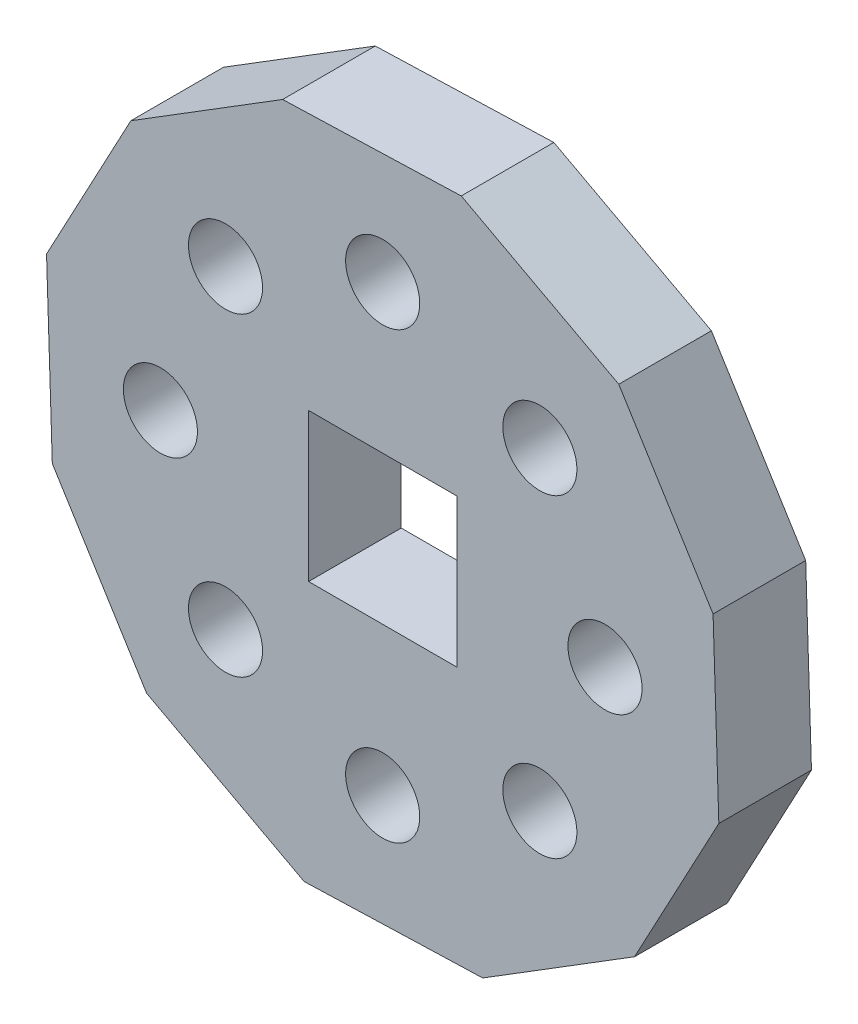
ISO-10303-21;
HEADER;
FILE_DESCRIPTION(('STEP AP214'),'2;1');
FILE_NAME('part.step','',(''),(''),'','','');
FILE_SCHEMA(('AUTOMOTIVE_DESIGN { 1 0 10303 214 1 1 1 1 }'));
ENDSEC;
DATA;
#1=APPLICATION_CONTEXT('core data for automotive mechanical design processes');
#2=APPLICATION_PROTOCOL_DEFINITION('international standard','automotive_design',2000,#1);
#3=PRODUCT_CONTEXT('',#1,'mechanical');
#4=PRODUCT('Part','Part','',(#3));
#5=PRODUCT_RELATED_PRODUCT_CATEGORY('part','',(#4));
#6=PRODUCT_DEFINITION_FORMATION('','',#4);
#7=PRODUCT_DEFINITION_CONTEXT('part definition',#1,'design');
#8=PRODUCT_DEFINITION('design','',#6,#7);
#9=PRODUCT_DEFINITION_SHAPE('','',#8);
#10=(LENGTH_UNIT() NAMED_UNIT(*) SI_UNIT(.MILLI.,.METRE.));
#11=(NAMED_UNIT(*) PLANE_ANGLE_UNIT() SI_UNIT($,.RADIAN.));
#12=(NAMED_UNIT(*) SI_UNIT($,.STERADIAN.) SOLID_ANGLE_UNIT());
#13=UNCERTAINTY_MEASURE_WITH_UNIT(LENGTH_MEASURE(1.E-05),#10,'distance_accuracy_value','');
#14=(GEOMETRIC_REPRESENTATION_CONTEXT(3) GLOBAL_UNCERTAINTY_ASSIGNED_CONTEXT((#13)) GLOBAL_UNIT_ASSIGNED_CONTEXT((#10,
#11,#12)) REPRESENTATION_CONTEXT('',''));
#15=CARTESIAN_POINT('',(0.,0.,0.));
#16=DIRECTION('',(0.,0.,1.));
#17=DIRECTION('',(1.,0.,0.));
#18=AXIS2_PLACEMENT_3D('',#15,#16,#17);
#19=CARTESIAN_POINT('',(0.,0.,25.));
#20=DIRECTION('',(0.,0.,1.));
#21=DIRECTION('',(1.,0.,0.));
#22=AXIS2_PLACEMENT_3D('',#19,#20,#21);
#23=PLANE('',#22);
#24=CARTESIAN_POINT('',(-59.9999999999974,-2.55795384873636E-12,25.));
#25=DIRECTION('',(0.,0.,1.));
#26=DIRECTION('',(1.,0.,0.));
#27=AXIS2_PLACEMENT_3D('',#24,#25,#26);
#28=CIRCLE('',#27,10.0000000000038);
#29=CARTESIAN_POINT('',(-49.9999999999937,-2.55795384873636E-12,25.));
#30=VERTEX_POINT('',#29);
#31=EDGE_CURVE('E565',#30,#30,#28,.T.);
#32=ORIENTED_EDGE('',*,*,#31,.F.);
#33=EDGE_LOOP('',(#32));
#34=FACE_BOUND('',#33,.T.);
#35=CARTESIAN_POINT('',(5.10121193588295E-12,-60.,25.));
#36=DIRECTION('',(0.,0.,1.));
#37=DIRECTION('',(1.,0.,0.));
#38=AXIS2_PLACEMENT_3D('',#35,#36,#37);
#39=CIRCLE('',#38,10.0000000000053);
#40=CARTESIAN_POINT('',(10.0000000000104,-60.,25.));
#41=VERTEX_POINT('',#40);
#42=EDGE_CURVE('E577',#41,#41,#39,.T.);
#43=ORIENTED_EDGE('',*,*,#42,.F.);
#44=EDGE_LOOP('',(#43));
#45=FACE_BOUND('',#44,.T.);
#46=CARTESIAN_POINT('',(60.0000000000025,2.55060596794148E-12,25.));
#47=DIRECTION('',(0.,0.,1.));
#48=DIRECTION('',(1.,0.,0.));
#49=AXIS2_PLACEMENT_3D('',#46,#47,#48);
#50=CIRCLE('',#49,10.0000000000019);
#51=CARTESIAN_POINT('',(70.0000000000044,2.55060596794148E-12,25.));
#52=VERTEX_POINT('',#51);
#53=EDGE_CURVE('E589',#52,#52,#50,.T.);
#54=ORIENTED_EDGE('',*,*,#53,.F.);
#55=EDGE_LOOP('',(#54));
#56=FACE_BOUND('',#55,.T.);
#57=CARTESIAN_POINT('',(0.,60.,25.));
#58=DIRECTION('',(0.,0.,1.));
#59=DIRECTION('',(1.,0.,0.));
#60=AXIS2_PLACEMENT_3D('',#57,#58,#59);
#61=CIRCLE('',#60,10.);
#62=CARTESIAN_POINT('',(10.,60.,25.));
#63=VERTEX_POINT('',#62);
#64=EDGE_CURVE('E175',#63,#63,#61,.T.);
#65=ORIENTED_EDGE('',*,*,#64,.F.);
#66=EDGE_LOOP('',(#65));
#67=FACE_BOUND('',#66,.T.);
#68=DIRECTION('',(-0.881703909292115,0.471803154227482,0.));
#69=VECTOR('',#68,1.);
#70=CARTESIAN_POINT('',(63.72495042171,67.9756171617366,25.));
#71=LINE('',#70,#69);
#72=CARTESIAN_POINT('',(63.72495042171,67.9756171617366,25.));
#73=VERTEX_POINT('',#72);
#74=CARTESIAN_POINT('',(21.1996173392367,90.7310865108443,25.));
#75=VERTEX_POINT('',#74);
#76=EDGE_CURVE('E185',#73,#75,#71,.T.);
#77=ORIENTED_EDGE('',*,*,#76,.T.);
#78=DIRECTION('',(-0.999479561176763,-0.0322584374994306,0.));
#79=VECTOR('',#78,1.);
#80=CARTESIAN_POINT('',(21.1996173392367,90.7310865108443,25.));
#81=LINE('',#80,#79);
#82=CARTESIAN_POINT('',(-27.0061360891342,89.1752345009731,25.));
#83=VERTEX_POINT('',#82);
#84=EDGE_CURVE('E188',#75,#83,#81,.T.);
#85=ORIENTED_EDGE('',*,*,#84,.T.);
#86=DIRECTION('',(-0.849445471792685,-0.527676406949281,0.));
#87=VECTOR('',#86,1.);
#88=CARTESIAN_POINT('',(-27.0061360891342,89.1752345009731,25.));
#89=LINE('',#88,#87);
#90=CARTESIAN_POINT('',(-67.9756171617365,63.7249504217102,25.));
#91=VERTEX_POINT('',#90);
#92=EDGE_CURVE('E191',#83,#91,#89,.T.);
#93=ORIENTED_EDGE('',*,*,#92,.T.);
#94=DIRECTION('',(-0.471803154227481,-0.881703909292116,0.));
#95=VECTOR('',#94,1.);
#96=CARTESIAN_POINT('',(-67.9756171617365,63.7249504217102,25.));
#97=LINE('',#96,#95);
#98=CARTESIAN_POINT('',(-90.7310865108443,21.1996173392366,25.));
#99=VERTEX_POINT('',#98);
#100=EDGE_CURVE('E193',#91,#99,#97,.T.);
#101=ORIENTED_EDGE('',*,*,#100,.T.);
#102=DIRECTION('',(0.0322584374994304,-0.999479561176763,0.));
#103=VECTOR('',#102,1.);
#104=CARTESIAN_POINT('',(-90.7310865108443,21.1996173392366,25.));
#105=LINE('',#104,#103);
#106=CARTESIAN_POINT('',(-89.1752345009731,-27.0061360891341,25.));
#107=VERTEX_POINT('',#106);
#108=EDGE_CURVE('E195',#99,#107,#105,.T.);
#109=ORIENTED_EDGE('',*,*,#108,.T.);
#110=DIRECTION('',(0.527676406949281,-0.849445471792685,0.));
#111=VECTOR('',#110,1.);
#112=CARTESIAN_POINT('',(-89.1752345009731,-27.0061360891341,25.));
#113=LINE('',#112,#111);
#114=CARTESIAN_POINT('',(-63.7249504217102,-67.9756171617364,25.));
#115=VERTEX_POINT('',#114);
#116=EDGE_CURVE('E197',#107,#115,#113,.T.);
#117=ORIENTED_EDGE('',*,*,#116,.T.);
#118=DIRECTION('',(0.881703909292115,-0.471803154227482,0.));
#119=VECTOR('',#118,1.);
#120=CARTESIAN_POINT('',(-63.7249504217102,-67.9756171617364,25.));
#121=LINE('',#120,#119);
#122=CARTESIAN_POINT('',(-21.1996173392367,-90.7310865108442,25.));
#123=VERTEX_POINT('',#122);
#124=EDGE_CURVE('E199',#115,#123,#121,.T.);
#125=ORIENTED_EDGE('',*,*,#124,.T.);
#126=DIRECTION('',(0.999479561176763,0.0322584374994309,0.));
#127=VECTOR('',#126,1.);
#128=CARTESIAN_POINT('',(-21.1996173392367,-90.7310865108442,25.));
#129=LINE('',#128,#127);
#130=CARTESIAN_POINT('',(27.0061360891342,-89.175234500973,25.));
#131=VERTEX_POINT('',#130);
#132=EDGE_CURVE('E201',#123,#131,#129,.T.);
#133=ORIENTED_EDGE('',*,*,#132,.T.);
#134=DIRECTION('',(0.849445471792685,0.527676406949281,0.));
#135=VECTOR('',#134,1.);
#136=CARTESIAN_POINT('',(27.0061360891342,-89.175234500973,25.));
#137=LINE('',#136,#135);
#138=CARTESIAN_POINT('',(67.9756171617364,-63.7249504217101,25.));
#139=VERTEX_POINT('',#138);
#140=EDGE_CURVE('E203',#131,#139,#137,.T.);
#141=ORIENTED_EDGE('',*,*,#140,.T.);
#142=DIRECTION('',(0.471803154227482,0.881703909292115,0.));
#143=VECTOR('',#142,1.);
#144=CARTESIAN_POINT('',(67.9756171617364,-63.7249504217101,25.));
#145=LINE('',#144,#143);
#146=CARTESIAN_POINT('',(90.7310865108443,-21.1996173392366,25.));
#147=VERTEX_POINT('',#146);
#148=EDGE_CURVE('E205',#139,#147,#145,.T.);
#149=ORIENTED_EDGE('',*,*,#148,.T.);
#150=DIRECTION('',(-0.0322584374994304,0.999479561176763,0.));
#151=VECTOR('',#150,1.);
#152=CARTESIAN_POINT('',(90.7310865108443,-21.1996173392366,25.));
#153=LINE('',#152,#151);
#154=CARTESIAN_POINT('',(89.1752345009731,27.0061360891341,25.));
#155=VERTEX_POINT('',#154);
#156=EDGE_CURVE('E207',#147,#155,#153,.T.);
#157=ORIENTED_EDGE('',*,*,#156,.T.);
#158=DIRECTION('',(-0.527676406949281,0.849445471792685,0.));
#159=VECTOR('',#158,1.);
#160=CARTESIAN_POINT('',(89.1752345009731,27.0061360891341,25.));
#161=LINE('',#160,#159);
#162=EDGE_CURVE('E209',#155,#73,#161,.T.);
#163=ORIENTED_EDGE('',*,*,#162,.T.);
#164=EDGE_LOOP('',(#77,#85,#93,#101,#109,#117,#125,#133,#141,#149,#157,#163));
#165=FACE_BOUND('',#164,.T.);
#166=DIRECTION('',(-1.,0.,0.));
#167=VECTOR('',#166,1.);
#168=CARTESIAN_POINT('',(-20.,20.,25.));
#169=LINE('',#168,#167);
#170=CARTESIAN_POINT('',(20.,20.,25.));
#171=VERTEX_POINT('',#170);
#172=CARTESIAN_POINT('',(-20.,20.,25.));
#173=VERTEX_POINT('',#172);
#174=EDGE_CURVE('E154',#171,#173,#169,.T.);
#175=ORIENTED_EDGE('',*,*,#174,.F.);
#176=DIRECTION('',(0.,1.,0.));
#177=VECTOR('',#176,1.);
#178=CARTESIAN_POINT('',(20.,-20.,25.));
#179=LINE('',#178,#177);
#180=CARTESIAN_POINT('',(20.,-20.,25.));
#181=VERTEX_POINT('',#180);
#182=EDGE_CURVE('E146',#181,#171,#179,.T.);
#183=ORIENTED_EDGE('',*,*,#182,.F.);
#184=DIRECTION('',(1.,0.,0.));
#185=VECTOR('',#184,1.);
#186=CARTESIAN_POINT('',(-20.,-20.,25.));
#187=LINE('',#186,#185);
#188=CARTESIAN_POINT('',(-20.,-20.,25.));
#189=VERTEX_POINT('',#188);
#190=EDGE_CURVE('E169',#189,#181,#187,.T.);
#191=ORIENTED_EDGE('',*,*,#190,.F.);
#192=DIRECTION('',(0.,-1.,0.));
#193=VECTOR('',#192,1.);
#194=CARTESIAN_POINT('',(-20.,-20.,25.));
#195=LINE('',#194,#193);
#196=EDGE_CURVE('E167',#173,#189,#195,.T.);
#197=ORIENTED_EDGE('',*,*,#196,.F.);
#198=EDGE_LOOP('',(#175,#183,#191,#197));
#199=FACE_BOUND('',#198,.T.);
#200=CARTESIAN_POINT('',(42.4264068711929,42.4264068711928,25.));
#201=DIRECTION('',(0.,0.,1.));
#202=DIRECTION('',(1.,0.,0.));
#203=AXIS2_PLACEMENT_3D('',#200,#201,#202);
#204=CIRCLE('',#203,10.);
#205=CARTESIAN_POINT('',(52.4264068711929,42.4264068711928,25.));
#206=VERTEX_POINT('',#205);
#207=EDGE_CURVE('E595',#206,#206,#204,.T.);
#208=ORIENTED_EDGE('',*,*,#207,.F.);
#209=EDGE_LOOP('',(#208));
#210=FACE_BOUND('',#209,.T.);
#211=CARTESIAN_POINT('',(42.4264068711972,-42.426406871191,25.));
#212=DIRECTION('',(0.,0.,1.));
#213=DIRECTION('',(1.,0.,0.));
#214=AXIS2_PLACEMENT_3D('',#211,#212,#213);
#215=CIRCLE('',#214,10.0000000000039);
#216=CARTESIAN_POINT('',(52.4264068712011,-42.426406871191,25.));
#217=VERTEX_POINT('',#216);
#218=EDGE_CURVE('E583',#217,#217,#215,.T.);
#219=ORIENTED_EDGE('',*,*,#218,.F.);
#220=EDGE_LOOP('',(#219));
#221=FACE_BOUND('',#220,.T.);
#222=CARTESIAN_POINT('',(-42.4264068711885,-42.4264068711947,25.));
#223=DIRECTION('',(0.,0.,1.));
#224=DIRECTION('',(1.,0.,0.));
#225=AXIS2_PLACEMENT_3D('',#222,#223,#224);
#226=CIRCLE('',#225,10.0000000000052);
#227=CARTESIAN_POINT('',(-32.4264068711833,-42.4264068711947,25.));
#228=VERTEX_POINT('',#227);
#229=EDGE_CURVE('E571',#228,#228,#226,.T.);
#230=ORIENTED_EDGE('',*,*,#229,.F.);
#231=EDGE_LOOP('',(#230));
#232=FACE_BOUND('',#231,.T.);
#233=CARTESIAN_POINT('',(-42.4264068711921,42.426406871191,25.));
#234=DIRECTION('',(0.,0.,1.));
#235=DIRECTION('',(1.,0.,0.));
#236=AXIS2_PLACEMENT_3D('',#233,#234,#235);
#237=CIRCLE('',#236,10.0000000000019);
#238=CARTESIAN_POINT('',(-32.4264068711902,42.426406871191,25.));
#239=VERTEX_POINT('',#238);
#240=EDGE_CURVE('E556',#239,#239,#237,.T.);
#241=ORIENTED_EDGE('',*,*,#240,.F.);
#242=EDGE_LOOP('',(#241));
#243=FACE_BOUND('',#242,.T.);
#244=ADVANCED_FACE('F33',(#34,#45,#56,#67,#165,#199,#210,#221,#232,#243),#23,.T.);
#245=CARTESIAN_POINT('',(0.,0.,0.));
#246=DIRECTION('',(0.,0.,1.));
#247=DIRECTION('',(1.,0.,0.));
#248=AXIS2_PLACEMENT_3D('',#245,#246,#247);
#249=PLANE('',#248);
#250=DIRECTION('',(-0.881703909292115,0.471803154227482,0.));
#251=VECTOR('',#250,1.);
#252=CARTESIAN_POINT('',(63.72495042171,67.9756171617366,0.));
#253=LINE('',#252,#251);
#254=CARTESIAN_POINT('',(63.72495042171,67.9756171617366,0.));
#255=VERTEX_POINT('',#254);
#256=CARTESIAN_POINT('',(21.1996173392367,90.7310865108443,0.));
#257=VERTEX_POINT('',#256);
#258=EDGE_CURVE('E162',#255,#257,#253,.T.);
#259=ORIENTED_EDGE('',*,*,#258,.F.);
#260=DIRECTION('',(-0.527676406949281,0.849445471792685,0.));
#261=VECTOR('',#260,1.);
#262=CARTESIAN_POINT('',(89.1752345009731,27.0061360891341,0.));
#263=LINE('',#262,#261);
#264=CARTESIAN_POINT('',(89.1752345009731,27.0061360891341,0.));
#265=VERTEX_POINT('',#264);
#266=EDGE_CURVE('E189',#265,#255,#263,.T.);
#267=ORIENTED_EDGE('',*,*,#266,.F.);
#268=DIRECTION('',(-0.0322584374994304,0.999479561176763,0.));
#269=VECTOR('',#268,1.);
#270=CARTESIAN_POINT('',(90.7310865108443,-21.1996173392366,0.));
#271=LINE('',#270,#269);
#272=CARTESIAN_POINT('',(90.7310865108443,-21.1996173392366,0.));
#273=VERTEX_POINT('',#272);
#274=EDGE_CURVE('E232',#273,#265,#271,.T.);
#275=ORIENTED_EDGE('',*,*,#274,.F.);
#276=DIRECTION('',(0.471803154227482,0.881703909292115,0.));
#277=VECTOR('',#276,1.);
#278=CARTESIAN_POINT('',(67.9756171617364,-63.7249504217101,0.));
#279=LINE('',#278,#277);
#280=CARTESIAN_POINT('',(67.9756171617364,-63.7249504217101,0.));
#281=VERTEX_POINT('',#280);
#282=EDGE_CURVE('E230',#281,#273,#279,.T.);
#283=ORIENTED_EDGE('',*,*,#282,.F.);
#284=DIRECTION('',(0.849445471792685,0.527676406949281,0.));
#285=VECTOR('',#284,1.);
#286=CARTESIAN_POINT('',(27.0061360891342,-89.175234500973,0.));
#287=LINE('',#286,#285);
#288=CARTESIAN_POINT('',(27.0061360891342,-89.175234500973,0.));
#289=VERTEX_POINT('',#288);
#290=EDGE_CURVE('E228',#289,#281,#287,.T.);
#291=ORIENTED_EDGE('',*,*,#290,.F.);
#292=DIRECTION('',(0.999479561176763,0.0322584374994309,0.));
#293=VECTOR('',#292,1.);
#294=CARTESIAN_POINT('',(-21.1996173392367,-90.7310865108442,0.));
#295=LINE('',#294,#293);
#296=CARTESIAN_POINT('',(-21.1996173392367,-90.7310865108442,0.));
#297=VERTEX_POINT('',#296);
#298=EDGE_CURVE('E226',#297,#289,#295,.T.);
#299=ORIENTED_EDGE('',*,*,#298,.F.);
#300=DIRECTION('',(0.881703909292115,-0.471803154227482,0.));
#301=VECTOR('',#300,1.);
#302=CARTESIAN_POINT('',(-63.7249504217102,-67.9756171617364,0.));
#303=LINE('',#302,#301);
#304=CARTESIAN_POINT('',(-63.7249504217102,-67.9756171617364,0.));
#305=VERTEX_POINT('',#304);
#306=EDGE_CURVE('E224',#305,#297,#303,.T.);
#307=ORIENTED_EDGE('',*,*,#306,.F.);
#308=DIRECTION('',(0.527676406949281,-0.849445471792685,0.));
#309=VECTOR('',#308,1.);
#310=CARTESIAN_POINT('',(-89.1752345009731,-27.0061360891341,0.));
#311=LINE('',#310,#309);
#312=CARTESIAN_POINT('',(-89.1752345009731,-27.0061360891341,0.));
#313=VERTEX_POINT('',#312);
#314=EDGE_CURVE('E222',#313,#305,#311,.T.);
#315=ORIENTED_EDGE('',*,*,#314,.F.);
#316=DIRECTION('',(0.0322584374994304,-0.999479561176763,0.));
#317=VECTOR('',#316,1.);
#318=CARTESIAN_POINT('',(-90.7310865108443,21.1996173392366,0.));
#319=LINE('',#318,#317);
#320=CARTESIAN_POINT('',(-90.7310865108443,21.1996173392366,0.));
#321=VERTEX_POINT('',#320);
#322=EDGE_CURVE('E220',#321,#313,#319,.T.);
#323=ORIENTED_EDGE('',*,*,#322,.F.);
#324=DIRECTION('',(-0.471803154227481,-0.881703909292116,0.));
#325=VECTOR('',#324,1.);
#326=CARTESIAN_POINT('',(-67.9756171617365,63.7249504217102,0.));
#327=LINE('',#326,#325);
#328=CARTESIAN_POINT('',(-67.9756171617365,63.7249504217102,0.));
#329=VERTEX_POINT('',#328);
#330=EDGE_CURVE('E218',#329,#321,#327,.T.);
#331=ORIENTED_EDGE('',*,*,#330,.F.);
#332=DIRECTION('',(-0.849445471792685,-0.527676406949281,0.));
#333=VECTOR('',#332,1.);
#334=CARTESIAN_POINT('',(-27.0061360891342,89.1752345009731,0.));
#335=LINE('',#334,#333);
#336=CARTESIAN_POINT('',(-27.0061360891342,89.1752345009731,0.));
#337=VERTEX_POINT('',#336);
#338=EDGE_CURVE('E216',#337,#329,#335,.T.);
#339=ORIENTED_EDGE('',*,*,#338,.F.);
#340=DIRECTION('',(-0.999479561176763,-0.0322584374994306,0.));
#341=VECTOR('',#340,1.);
#342=CARTESIAN_POINT('',(21.1996173392367,90.7310865108443,0.));
#343=LINE('',#342,#341);
#344=EDGE_CURVE('E214',#257,#337,#343,.T.);
#345=ORIENTED_EDGE('',*,*,#344,.F.);
#346=EDGE_LOOP('',(#259,#267,#275,#283,#291,#299,#307,#315,#323,#331,#339,#345));
#347=FACE_BOUND('',#346,.T.);
#348=DIRECTION('',(0.,1.,0.));
#349=VECTOR('',#348,1.);
#350=CARTESIAN_POINT('',(20.,-20.,0.));
#351=LINE('',#350,#349);
#352=CARTESIAN_POINT('',(20.,-20.,0.));
#353=VERTEX_POINT('',#352);
#354=CARTESIAN_POINT('',(20.,20.,0.));
#355=VERTEX_POINT('',#354);
#356=EDGE_CURVE('E56',#353,#355,#351,.T.);
#357=ORIENTED_EDGE('',*,*,#356,.T.);
#358=DIRECTION('',(-1.,0.,0.));
#359=VECTOR('',#358,1.);
#360=CARTESIAN_POINT('',(-20.,20.,0.));
#361=LINE('',#360,#359);
#362=CARTESIAN_POINT('',(-20.,20.,0.));
#363=VERTEX_POINT('',#362);
#364=EDGE_CURVE('E161',#355,#363,#361,.T.);
#365=ORIENTED_EDGE('',*,*,#364,.T.);
#366=DIRECTION('',(0.,-1.,0.));
#367=VECTOR('',#366,1.);
#368=CARTESIAN_POINT('',(-20.,-20.,0.));
#369=LINE('',#368,#367);
#370=CARTESIAN_POINT('',(-20.,-20.,0.));
#371=VERTEX_POINT('',#370);
#372=EDGE_CURVE('E177',#363,#371,#369,.T.);
#373=ORIENTED_EDGE('',*,*,#372,.T.);
#374=DIRECTION('',(1.,0.,0.));
#375=VECTOR('',#374,1.);
#376=CARTESIAN_POINT('',(-20.,-20.,0.));
#377=LINE('',#376,#375);
#378=EDGE_CURVE('E155',#371,#353,#377,.T.);
#379=ORIENTED_EDGE('',*,*,#378,.T.);
#380=EDGE_LOOP('',(#357,#365,#373,#379));
#381=FACE_BOUND('',#380,.T.);
#382=CARTESIAN_POINT('',(0.,60.,0.));
#383=DIRECTION('',(0.,0.,1.));
#384=DIRECTION('',(1.,0.,0.));
#385=AXIS2_PLACEMENT_3D('',#382,#383,#384);
#386=CIRCLE('',#385,10.);
#387=CARTESIAN_POINT('',(10.,60.,0.));
#388=VERTEX_POINT('',#387);
#389=EDGE_CURVE('E598',#388,#388,#386,.T.);
#390=ORIENTED_EDGE('',*,*,#389,.T.);
#391=EDGE_LOOP('',(#390));
#392=FACE_BOUND('',#391,.T.);
#393=CARTESIAN_POINT('',(42.4264068711929,42.4264068711928,0.));
#394=DIRECTION('',(0.,0.,1.));
#395=DIRECTION('',(1.,0.,0.));
#396=AXIS2_PLACEMENT_3D('',#393,#394,#395);
#397=CIRCLE('',#396,10.);
#398=CARTESIAN_POINT('',(52.4264068711929,42.4264068711928,0.));
#399=VERTEX_POINT('',#398);
#400=EDGE_CURVE('E592',#399,#399,#397,.T.);
#401=ORIENTED_EDGE('',*,*,#400,.T.);
#402=EDGE_LOOP('',(#401));
#403=FACE_BOUND('',#402,.T.);
#404=CARTESIAN_POINT('',(60.0000000000025,2.55060596794148E-12,0.));
#405=DIRECTION('',(0.,0.,1.));
#406=DIRECTION('',(1.,0.,0.));
#407=AXIS2_PLACEMENT_3D('',#404,#405,#406);
#408=CIRCLE('',#407,10.0000000000019);
#409=CARTESIAN_POINT('',(70.0000000000044,2.55060596794148E-12,0.));
#410=VERTEX_POINT('',#409);
#411=EDGE_CURVE('E586',#410,#410,#408,.T.);
#412=ORIENTED_EDGE('',*,*,#411,.T.);
#413=EDGE_LOOP('',(#412));
#414=FACE_BOUND('',#413,.T.);
#415=CARTESIAN_POINT('',(42.4264068711972,-42.426406871191,0.));
#416=DIRECTION('',(0.,0.,1.));
#417=DIRECTION('',(1.,0.,0.));
#418=AXIS2_PLACEMENT_3D('',#415,#416,#417);
#419=CIRCLE('',#418,10.0000000000039);
#420=CARTESIAN_POINT('',(52.4264068712011,-42.426406871191,0.));
#421=VERTEX_POINT('',#420);
#422=EDGE_CURVE('E580',#421,#421,#419,.T.);
#423=ORIENTED_EDGE('',*,*,#422,.T.);
#424=EDGE_LOOP('',(#423));
#425=FACE_BOUND('',#424,.T.);
#426=CARTESIAN_POINT('',(5.10121193588295E-12,-60.,0.));
#427=DIRECTION('',(0.,0.,1.));
#428=DIRECTION('',(1.,0.,0.));
#429=AXIS2_PLACEMENT_3D('',#426,#427,#428);
#430=CIRCLE('',#429,10.0000000000053);
#431=CARTESIAN_POINT('',(10.0000000000104,-60.,0.));
#432=VERTEX_POINT('',#431);
#433=EDGE_CURVE('E574',#432,#432,#430,.T.);
#434=ORIENTED_EDGE('',*,*,#433,.T.);
#435=EDGE_LOOP('',(#434));
#436=FACE_BOUND('',#435,.T.);
#437=CARTESIAN_POINT('',(-42.4264068711885,-42.4264068711947,0.));
#438=DIRECTION('',(0.,0.,1.));
#439=DIRECTION('',(1.,0.,0.));
#440=AXIS2_PLACEMENT_3D('',#437,#438,#439);
#441=CIRCLE('',#440,10.0000000000052);
#442=CARTESIAN_POINT('',(-32.4264068711833,-42.4264068711947,0.));
#443=VERTEX_POINT('',#442);
#444=EDGE_CURVE('E568',#443,#443,#441,.T.);
#445=ORIENTED_EDGE('',*,*,#444,.T.);
#446=EDGE_LOOP('',(#445));
#447=FACE_BOUND('',#446,.T.);
#448=CARTESIAN_POINT('',(-59.9999999999974,-2.55795384873636E-12,0.));
#449=DIRECTION('',(0.,0.,1.));
#450=DIRECTION('',(1.,0.,0.));
#451=AXIS2_PLACEMENT_3D('',#448,#449,#450);
#452=CIRCLE('',#451,10.0000000000038);
#453=CARTESIAN_POINT('',(-49.9999999999937,-2.55795384873636E-12,0.));
#454=VERTEX_POINT('',#453);
#455=EDGE_CURVE('E562',#454,#454,#452,.T.);
#456=ORIENTED_EDGE('',*,*,#455,.T.);
#457=EDGE_LOOP('',(#456));
#458=FACE_BOUND('',#457,.T.);
#459=CARTESIAN_POINT('',(-42.4264068711921,42.426406871191,0.));
#460=DIRECTION('',(0.,0.,1.));
#461=DIRECTION('',(1.,0.,0.));
#462=AXIS2_PLACEMENT_3D('',#459,#460,#461);
#463=CIRCLE('',#462,10.0000000000019);
#464=CARTESIAN_POINT('',(-32.4264068711902,42.426406871191,0.));
#465=VERTEX_POINT('',#464);
#466=EDGE_CURVE('E559',#465,#465,#463,.T.);
#467=ORIENTED_EDGE('',*,*,#466,.T.);
#468=EDGE_LOOP('',(#467));
#469=FACE_BOUND('',#468,.T.);
#470=ADVANCED_FACE('F274',(#347,#381,#392,#403,#414,#425,#436,#447,#458,#469),#249,.F.);
#471=CARTESIAN_POINT('',(63.72495042171,67.9756171617366,25.));
#472=DIRECTION('',(-0.471803154227482,-0.881703909292115,0.));
#473=DIRECTION('',(0.881703909292116,-0.471803154227482,0.));
#474=AXIS2_PLACEMENT_3D('',#471,#472,#473);
#475=PLANE('',#474);
#476=ORIENTED_EDGE('',*,*,#258,.T.);
#477=DIRECTION('',(0.,0.,-1.));
#478=VECTOR('',#477,1.);
#479=CARTESIAN_POINT('',(21.1996173392367,90.7310865108443,25.));
#480=LINE('',#479,#478);
#481=EDGE_CURVE('E11',#75,#257,#480,.T.);
#482=ORIENTED_EDGE('',*,*,#481,.F.);
#483=ORIENTED_EDGE('',*,*,#76,.F.);
#484=DIRECTION('',(0.,0.,-1.));
#485=VECTOR('',#484,1.);
#486=CARTESIAN_POINT('',(63.72495042171,67.9756171617366,25.));
#487=LINE('',#486,#485);
#488=EDGE_CURVE('E211',#73,#255,#487,.T.);
#489=ORIENTED_EDGE('',*,*,#488,.T.);
#490=EDGE_LOOP('',(#476,#482,#483,#489));
#491=FACE_BOUND('',#490,.T.);
#492=ADVANCED_FACE('F35',(#491),#475,.F.);
#493=CARTESIAN_POINT('',(21.1996173392367,90.7310865108443,25.));
#494=DIRECTION('',(0.0322584374994306,-0.999479561176763,0.));
#495=DIRECTION('',(0.999479561176763,0.0322584374994306,0.));
#496=AXIS2_PLACEMENT_3D('',#493,#494,#495);
#497=PLANE('',#496);
#498=ORIENTED_EDGE('',*,*,#344,.T.);
#499=DIRECTION('',(0.,0.,-1.));
#500=VECTOR('',#499,1.);
#501=CARTESIAN_POINT('',(-27.0061360891342,89.1752345009731,25.));
#502=LINE('',#501,#500);
#503=EDGE_CURVE('E41',#83,#337,#502,.T.);
#504=ORIENTED_EDGE('',*,*,#503,.F.);
#505=ORIENTED_EDGE('',*,*,#84,.F.);
#506=ORIENTED_EDGE('',*,*,#481,.T.);
#507=EDGE_LOOP('',(#498,#504,#505,#506));
#508=FACE_BOUND('',#507,.T.);
#509=ADVANCED_FACE('F291',(#508),#497,.F.);
#510=CARTESIAN_POINT('',(-27.0061360891342,89.1752345009731,25.));
#511=DIRECTION('',(0.527676406949281,-0.849445471792685,0.));
#512=DIRECTION('',(0.849445471792685,0.527676406949281,0.));
#513=AXIS2_PLACEMENT_3D('',#510,#511,#512);
#514=PLANE('',#513);
#515=ORIENTED_EDGE('',*,*,#338,.T.);
#516=DIRECTION('',(0.,0.,-1.));
#517=VECTOR('',#516,1.);
#518=CARTESIAN_POINT('',(-67.9756171617365,63.7249504217102,25.));
#519=LINE('',#518,#517);
#520=EDGE_CURVE('E261',#91,#329,#519,.T.);
#521=ORIENTED_EDGE('',*,*,#520,.F.);
#522=ORIENTED_EDGE('',*,*,#92,.F.);
#523=ORIENTED_EDGE('',*,*,#503,.T.);
#524=EDGE_LOOP('',(#515,#521,#522,#523));
#525=FACE_BOUND('',#524,.T.);
#526=ADVANCED_FACE('F268',(#525),#514,.F.);
#527=CARTESIAN_POINT('',(-67.9756171617365,63.7249504217102,25.));
#528=DIRECTION('',(0.881703909292116,-0.471803154227481,0.));
#529=DIRECTION('',(0.471803154227481,0.881703909292116,0.));
#530=AXIS2_PLACEMENT_3D('',#527,#528,#529);
#531=PLANE('',#530);
#532=ORIENTED_EDGE('',*,*,#330,.T.);
#533=DIRECTION('',(0.,0.,-1.));
#534=VECTOR('',#533,1.);
#535=CARTESIAN_POINT('',(-90.7310865108443,21.1996173392366,25.));
#536=LINE('',#535,#534);
#537=EDGE_CURVE('E258',#99,#321,#536,.T.);
#538=ORIENTED_EDGE('',*,*,#537,.F.);
#539=ORIENTED_EDGE('',*,*,#100,.F.);
#540=ORIENTED_EDGE('',*,*,#520,.T.);
#541=EDGE_LOOP('',(#532,#538,#539,#540));
#542=FACE_BOUND('',#541,.T.);
#543=ADVANCED_FACE('F280',(#542),#531,.F.);
#544=CARTESIAN_POINT('',(-90.7310865108443,21.1996173392366,25.));
#545=DIRECTION('',(0.999479561176763,0.0322584374994304,0.));
#546=DIRECTION('',(-0.0322584374994304,0.999479561176763,0.));
#547=AXIS2_PLACEMENT_3D('',#544,#545,#546);
#548=PLANE('',#547);
#549=ORIENTED_EDGE('',*,*,#322,.T.);
#550=DIRECTION('',(0.,0.,-1.));
#551=VECTOR('',#550,1.);
#552=CARTESIAN_POINT('',(-89.1752345009731,-27.0061360891341,25.));
#553=LINE('',#552,#551);
#554=EDGE_CURVE('E255',#107,#313,#553,.T.);
#555=ORIENTED_EDGE('',*,*,#554,.F.);
#556=ORIENTED_EDGE('',*,*,#108,.F.);
#557=ORIENTED_EDGE('',*,*,#537,.T.);
#558=EDGE_LOOP('',(#549,#555,#556,#557));
#559=FACE_BOUND('',#558,.T.);
#560=ADVANCED_FACE('F284',(#559),#548,.F.);
#561=CARTESIAN_POINT('',(-89.1752345009731,-27.0061360891341,25.));
#562=DIRECTION('',(0.849445471792685,0.527676406949281,0.));
#563=DIRECTION('',(-0.527676406949281,0.849445471792685,0.));
#564=AXIS2_PLACEMENT_3D('',#561,#562,#563);
#565=PLANE('',#564);
#566=ORIENTED_EDGE('',*,*,#314,.T.);
#567=DIRECTION('',(0.,0.,-1.));
#568=VECTOR('',#567,1.);
#569=CARTESIAN_POINT('',(-63.7249504217102,-67.9756171617364,25.));
#570=LINE('',#569,#568);
#571=EDGE_CURVE('E252',#115,#305,#570,.T.);
#572=ORIENTED_EDGE('',*,*,#571,.F.);
#573=ORIENTED_EDGE('',*,*,#116,.F.);
#574=ORIENTED_EDGE('',*,*,#554,.T.);
#575=EDGE_LOOP('',(#566,#572,#573,#574));
#576=FACE_BOUND('',#575,.T.);
#577=ADVANCED_FACE('F324',(#576),#565,.F.);
#578=CARTESIAN_POINT('',(-63.7249504217102,-67.9756171617364,25.));
#579=DIRECTION('',(0.471803154227482,0.881703909292115,0.));
#580=DIRECTION('',(-0.881703909292115,0.471803154227482,0.));
#581=AXIS2_PLACEMENT_3D('',#578,#579,#580);
#582=PLANE('',#581);
#583=ORIENTED_EDGE('',*,*,#306,.T.);
#584=DIRECTION('',(0.,0.,-1.));
#585=VECTOR('',#584,1.);
#586=CARTESIAN_POINT('',(-21.1996173392367,-90.7310865108442,25.));
#587=LINE('',#586,#585);
#588=EDGE_CURVE('E249',#123,#297,#587,.T.);
#589=ORIENTED_EDGE('',*,*,#588,.F.);
#590=ORIENTED_EDGE('',*,*,#124,.F.);
#591=ORIENTED_EDGE('',*,*,#571,.T.);
#592=EDGE_LOOP('',(#583,#589,#590,#591));
#593=FACE_BOUND('',#592,.T.);
#594=ADVANCED_FACE('F322',(#593),#582,.F.);
#595=CARTESIAN_POINT('',(-21.1996173392367,-90.7310865108442,25.));
#596=DIRECTION('',(-0.0322584374994309,0.999479561176763,0.));
#597=DIRECTION('',(-0.999479561176763,-0.0322584374994309,0.));
#598=AXIS2_PLACEMENT_3D('',#595,#596,#597);
#599=PLANE('',#598);
#600=ORIENTED_EDGE('',*,*,#298,.T.);
#601=DIRECTION('',(0.,0.,-1.));
#602=VECTOR('',#601,1.);
#603=CARTESIAN_POINT('',(27.0061360891342,-89.175234500973,25.));
#604=LINE('',#603,#602);
#605=EDGE_CURVE('E246',#131,#289,#604,.T.);
#606=ORIENTED_EDGE('',*,*,#605,.F.);
#607=ORIENTED_EDGE('',*,*,#132,.F.);
#608=ORIENTED_EDGE('',*,*,#588,.T.);
#609=EDGE_LOOP('',(#600,#606,#607,#608));
#610=FACE_BOUND('',#609,.T.);
#611=ADVANCED_FACE('F318',(#610),#599,.F.);
#612=CARTESIAN_POINT('',(27.0061360891342,-89.175234500973,25.));
#613=DIRECTION('',(-0.527676406949281,0.849445471792685,0.));
#614=DIRECTION('',(-0.849445471792685,-0.527676406949281,0.));
#615=AXIS2_PLACEMENT_3D('',#612,#613,#614);
#616=PLANE('',#615);
#617=ORIENTED_EDGE('',*,*,#290,.T.);
#618=DIRECTION('',(0.,0.,-1.));
#619=VECTOR('',#618,1.);
#620=CARTESIAN_POINT('',(67.9756171617364,-63.7249504217101,25.));
#621=LINE('',#620,#619);
#622=EDGE_CURVE('E243',#139,#281,#621,.T.);
#623=ORIENTED_EDGE('',*,*,#622,.F.);
#624=ORIENTED_EDGE('',*,*,#140,.F.);
#625=ORIENTED_EDGE('',*,*,#605,.T.);
#626=EDGE_LOOP('',(#617,#623,#624,#625));
#627=FACE_BOUND('',#626,.T.);
#628=ADVANCED_FACE('F313',(#627),#616,.F.);
#629=CARTESIAN_POINT('',(67.9756171617364,-63.7249504217101,25.));
#630=DIRECTION('',(-0.881703909292115,0.471803154227482,0.));
#631=DIRECTION('',(-0.471803154227482,-0.881703909292115,0.));
#632=AXIS2_PLACEMENT_3D('',#629,#630,#631);
#633=PLANE('',#632);
#634=ORIENTED_EDGE('',*,*,#282,.T.);
#635=DIRECTION('',(0.,0.,-1.));
#636=VECTOR('',#635,1.);
#637=CARTESIAN_POINT('',(90.7310865108443,-21.1996173392366,25.));
#638=LINE('',#637,#636);
#639=EDGE_CURVE('E240',#147,#273,#638,.T.);
#640=ORIENTED_EDGE('',*,*,#639,.F.);
#641=ORIENTED_EDGE('',*,*,#148,.F.);
#642=ORIENTED_EDGE('',*,*,#622,.T.);
#643=EDGE_LOOP('',(#634,#640,#641,#642));
#644=FACE_BOUND('',#643,.T.);
#645=ADVANCED_FACE('F307',(#644),#633,.F.);
#646=CARTESIAN_POINT('',(90.7310865108443,-21.1996173392366,25.));
#647=DIRECTION('',(-0.999479561176763,-0.0322584374994304,0.));
#648=DIRECTION('',(0.0322584374994304,-0.999479561176763,0.));
#649=AXIS2_PLACEMENT_3D('',#646,#647,#648);
#650=PLANE('',#649);
#651=ORIENTED_EDGE('',*,*,#274,.T.);
#652=DIRECTION('',(0.,0.,-1.));
#653=VECTOR('',#652,1.);
#654=CARTESIAN_POINT('',(89.1752345009731,27.0061360891341,25.));
#655=LINE('',#654,#653);
#656=EDGE_CURVE('E237',#155,#265,#655,.T.);
#657=ORIENTED_EDGE('',*,*,#656,.F.);
#658=ORIENTED_EDGE('',*,*,#156,.F.);
#659=ORIENTED_EDGE('',*,*,#639,.T.);
#660=EDGE_LOOP('',(#651,#657,#658,#659));
#661=FACE_BOUND('',#660,.T.);
#662=ADVANCED_FACE('F303',(#661),#650,.F.);
#663=CARTESIAN_POINT('',(89.1752345009731,27.0061360891341,25.));
#664=DIRECTION('',(-0.849445471792685,-0.527676406949281,0.));
#665=DIRECTION('',(0.527676406949281,-0.849445471792685,0.));
#666=AXIS2_PLACEMENT_3D('',#663,#664,#665);
#667=PLANE('',#666);
#668=ORIENTED_EDGE('',*,*,#266,.T.);
#669=ORIENTED_EDGE('',*,*,#488,.F.);
#670=ORIENTED_EDGE('',*,*,#162,.F.);
#671=ORIENTED_EDGE('',*,*,#656,.T.);
#672=EDGE_LOOP('',(#668,#669,#670,#671));
#673=FACE_BOUND('',#672,.T.);
#674=ADVANCED_FACE('F298',(#673),#667,.F.);
#675=CARTESIAN_POINT('',(20.,-20.,25.));
#676=DIRECTION('',(-1.,0.,0.));
#677=DIRECTION('',(0.,0.,1.));
#678=AXIS2_PLACEMENT_3D('',#675,#676,#677);
#679=PLANE('',#678);
#680=ORIENTED_EDGE('',*,*,#356,.F.);
#681=DIRECTION('',(0.,0.,-1.));
#682=VECTOR('',#681,1.);
#683=CARTESIAN_POINT('',(20.,-20.,25.));
#684=LINE('',#683,#682);
#685=EDGE_CURVE('E150',#181,#353,#684,.T.);
#686=ORIENTED_EDGE('',*,*,#685,.F.);
#687=ORIENTED_EDGE('',*,*,#182,.T.);
#688=DIRECTION('',(0.,0.,-1.));
#689=VECTOR('',#688,1.);
#690=CARTESIAN_POINT('',(20.,20.,25.));
#691=LINE('',#690,#689);
#692=EDGE_CURVE('E149',#171,#355,#691,.T.);
#693=ORIENTED_EDGE('',*,*,#692,.T.);
#694=EDGE_LOOP('',(#680,#686,#687,#693));
#695=FACE_BOUND('',#694,.T.);
#696=ADVANCED_FACE('F148',(#695),#679,.T.);
#697=CARTESIAN_POINT('',(-20.,20.,25.));
#698=DIRECTION('',(0.,-1.,0.));
#699=DIRECTION('',(0.,0.,-1.));
#700=AXIS2_PLACEMENT_3D('',#697,#698,#699);
#701=PLANE('',#700);
#702=ORIENTED_EDGE('',*,*,#364,.F.);
#703=ORIENTED_EDGE('',*,*,#692,.F.);
#704=ORIENTED_EDGE('',*,*,#174,.T.);
#705=DIRECTION('',(0.,0.,-1.));
#706=VECTOR('',#705,1.);
#707=CARTESIAN_POINT('',(-20.,20.,25.));
#708=LINE('',#707,#706);
#709=EDGE_CURVE('E163',#173,#363,#708,.T.);
#710=ORIENTED_EDGE('',*,*,#709,.T.);
#711=EDGE_LOOP('',(#702,#703,#704,#710));
#712=FACE_BOUND('',#711,.T.);
#713=ADVANCED_FACE('F158',(#712),#701,.T.);
#714=CARTESIAN_POINT('',(-20.,-20.,25.));
#715=DIRECTION('',(1.,0.,0.));
#716=DIRECTION('',(0.,0.,-1.));
#717=AXIS2_PLACEMENT_3D('',#714,#715,#716);
#718=PLANE('',#717);
#719=ORIENTED_EDGE('',*,*,#372,.F.);
#720=ORIENTED_EDGE('',*,*,#709,.F.);
#721=ORIENTED_EDGE('',*,*,#196,.T.);
#722=DIRECTION('',(0.,0.,-1.));
#723=VECTOR('',#722,1.);
#724=CARTESIAN_POINT('',(-20.,-20.,25.));
#725=LINE('',#724,#723);
#726=EDGE_CURVE('E48',#189,#371,#725,.T.);
#727=ORIENTED_EDGE('',*,*,#726,.T.);
#728=EDGE_LOOP('',(#719,#720,#721,#727));
#729=FACE_BOUND('',#728,.T.);
#730=ADVANCED_FACE('F385',(#729),#718,.T.);
#731=CARTESIAN_POINT('',(-20.,-20.,25.));
#732=DIRECTION('',(0.,1.,0.));
#733=DIRECTION('',(0.,0.,1.));
#734=AXIS2_PLACEMENT_3D('',#731,#732,#733);
#735=PLANE('',#734);
#736=ORIENTED_EDGE('',*,*,#378,.F.);
#737=ORIENTED_EDGE('',*,*,#726,.F.);
#738=ORIENTED_EDGE('',*,*,#190,.T.);
#739=ORIENTED_EDGE('',*,*,#685,.T.);
#740=EDGE_LOOP('',(#736,#737,#738,#739));
#741=FACE_BOUND('',#740,.T.);
#742=ADVANCED_FACE('F391',(#741),#735,.T.);
#743=CARTESIAN_POINT('',(0.,60.,25.));
#744=DIRECTION('',(0.,0.,-1.));
#745=DIRECTION('',(-1.,0.,0.));
#746=AXIS2_PLACEMENT_3D('',#743,#744,#745);
#747=CYLINDRICAL_SURFACE('',#746,10.);
#748=ORIENTED_EDGE('',*,*,#64,.T.);
#749=EDGE_LOOP('',(#748));
#750=FACE_BOUND('',#749,.T.);
#751=ORIENTED_EDGE('',*,*,#389,.F.);
#752=EDGE_LOOP('',(#751));
#753=FACE_BOUND('',#752,.T.);
#754=ADVANCED_FACE('F399',(#750,#753),#747,.F.);
#755=CARTESIAN_POINT('',(42.4264068711929,42.4264068711928,25.));
#756=DIRECTION('',(0.,0.,-1.));
#757=DIRECTION('',(-1.,0.,0.));
#758=AXIS2_PLACEMENT_3D('',#755,#756,#757);
#759=CYLINDRICAL_SURFACE('',#758,10.);
#760=ORIENTED_EDGE('',*,*,#207,.T.);
#761=EDGE_LOOP('',(#760));
#762=FACE_BOUND('',#761,.T.);
#763=ORIENTED_EDGE('',*,*,#400,.F.);
#764=EDGE_LOOP('',(#763));
#765=FACE_BOUND('',#764,.T.);
#766=ADVANCED_FACE('F406',(#762,#765),#759,.F.);
#767=CARTESIAN_POINT('',(60.0000000000025,2.55060596794148E-12,25.));
#768=DIRECTION('',(0.,0.,-1.));
#769=DIRECTION('',(-1.,0.,0.));
#770=AXIS2_PLACEMENT_3D('',#767,#768,#769);
#771=CYLINDRICAL_SURFACE('',#770,10.0000000000019);
#772=ORIENTED_EDGE('',*,*,#53,.T.);
#773=EDGE_LOOP('',(#772));
#774=FACE_BOUND('',#773,.T.);
#775=ORIENTED_EDGE('',*,*,#411,.F.);
#776=EDGE_LOOP('',(#775));
#777=FACE_BOUND('',#776,.T.);
#778=ADVANCED_FACE('F414',(#774,#777),#771,.F.);
#779=CARTESIAN_POINT('',(42.4264068711972,-42.426406871191,25.));
#780=DIRECTION('',(0.,0.,-1.));
#781=DIRECTION('',(-1.,0.,0.));
#782=AXIS2_PLACEMENT_3D('',#779,#780,#781);
#783=CYLINDRICAL_SURFACE('',#782,10.0000000000039);
#784=ORIENTED_EDGE('',*,*,#218,.T.);
#785=EDGE_LOOP('',(#784));
#786=FACE_BOUND('',#785,.T.);
#787=ORIENTED_EDGE('',*,*,#422,.F.);
#788=EDGE_LOOP('',(#787));
#789=FACE_BOUND('',#788,.T.);
#790=ADVANCED_FACE('F422',(#786,#789),#783,.F.);
#791=CARTESIAN_POINT('',(5.10121193588295E-12,-60.,25.));
#792=DIRECTION('',(0.,0.,-1.));
#793=DIRECTION('',(-1.,0.,0.));
#794=AXIS2_PLACEMENT_3D('',#791,#792,#793);
#795=CYLINDRICAL_SURFACE('',#794,10.0000000000053);
#796=ORIENTED_EDGE('',*,*,#42,.T.);
#797=EDGE_LOOP('',(#796));
#798=FACE_BOUND('',#797,.T.);
#799=ORIENTED_EDGE('',*,*,#433,.F.);
#800=EDGE_LOOP('',(#799));
#801=FACE_BOUND('',#800,.T.);
#802=ADVANCED_FACE('F430',(#798,#801),#795,.F.);
#803=CARTESIAN_POINT('',(-42.4264068711885,-42.4264068711947,25.));
#804=DIRECTION('',(0.,0.,-1.));
#805=DIRECTION('',(-1.,0.,0.));
#806=AXIS2_PLACEMENT_3D('',#803,#804,#805);
#807=CYLINDRICAL_SURFACE('',#806,10.0000000000052);
#808=ORIENTED_EDGE('',*,*,#229,.T.);
#809=EDGE_LOOP('',(#808));
#810=FACE_BOUND('',#809,.T.);
#811=ORIENTED_EDGE('',*,*,#444,.F.);
#812=EDGE_LOOP('',(#811));
#813=FACE_BOUND('',#812,.T.);
#814=ADVANCED_FACE('F438',(#810,#813),#807,.F.);
#815=CARTESIAN_POINT('',(-59.9999999999974,-2.55795384873636E-12,25.));
#816=DIRECTION('',(0.,0.,-1.));
#817=DIRECTION('',(-1.,0.,0.));
#818=AXIS2_PLACEMENT_3D('',#815,#816,#817);
#819=CYLINDRICAL_SURFACE('',#818,10.0000000000038);
#820=ORIENTED_EDGE('',*,*,#31,.T.);
#821=EDGE_LOOP('',(#820));
#822=FACE_BOUND('',#821,.T.);
#823=ORIENTED_EDGE('',*,*,#455,.F.);
#824=EDGE_LOOP('',(#823));
#825=FACE_BOUND('',#824,.T.);
#826=ADVANCED_FACE('F446',(#822,#825),#819,.F.);
#827=CARTESIAN_POINT('',(-42.4264068711921,42.426406871191,25.));
#828=DIRECTION('',(0.,0.,-1.));
#829=DIRECTION('',(-1.,0.,0.));
#830=AXIS2_PLACEMENT_3D('',#827,#828,#829);
#831=CYLINDRICAL_SURFACE('',#830,10.0000000000019);
#832=ORIENTED_EDGE('',*,*,#240,.T.);
#833=EDGE_LOOP('',(#832));
#834=FACE_BOUND('',#833,.T.);
#835=ORIENTED_EDGE('',*,*,#466,.F.);
#836=EDGE_LOOP('',(#835));
#837=FACE_BOUND('',#836,.T.);
#838=ADVANCED_FACE('F454',(#834,#837),#831,.F.);
#839=CLOSED_SHELL('',(#244,#470,#492,#509,#526,#543,#560,#577,#594,#611,#628,#645,#662,#674,
#696,#713,#730,#742,#754,#766,#778,#790,#802,#814,#826,#838));
#840=MANIFOLD_SOLID_BREP('B2',#839);
#841=ADVANCED_BREP_SHAPE_REPRESENTATION('',(#18,#840),#14);
#842=SHAPE_DEFINITION_REPRESENTATION(#9,#841);
ENDSEC;
END-ISO-10303-21;
